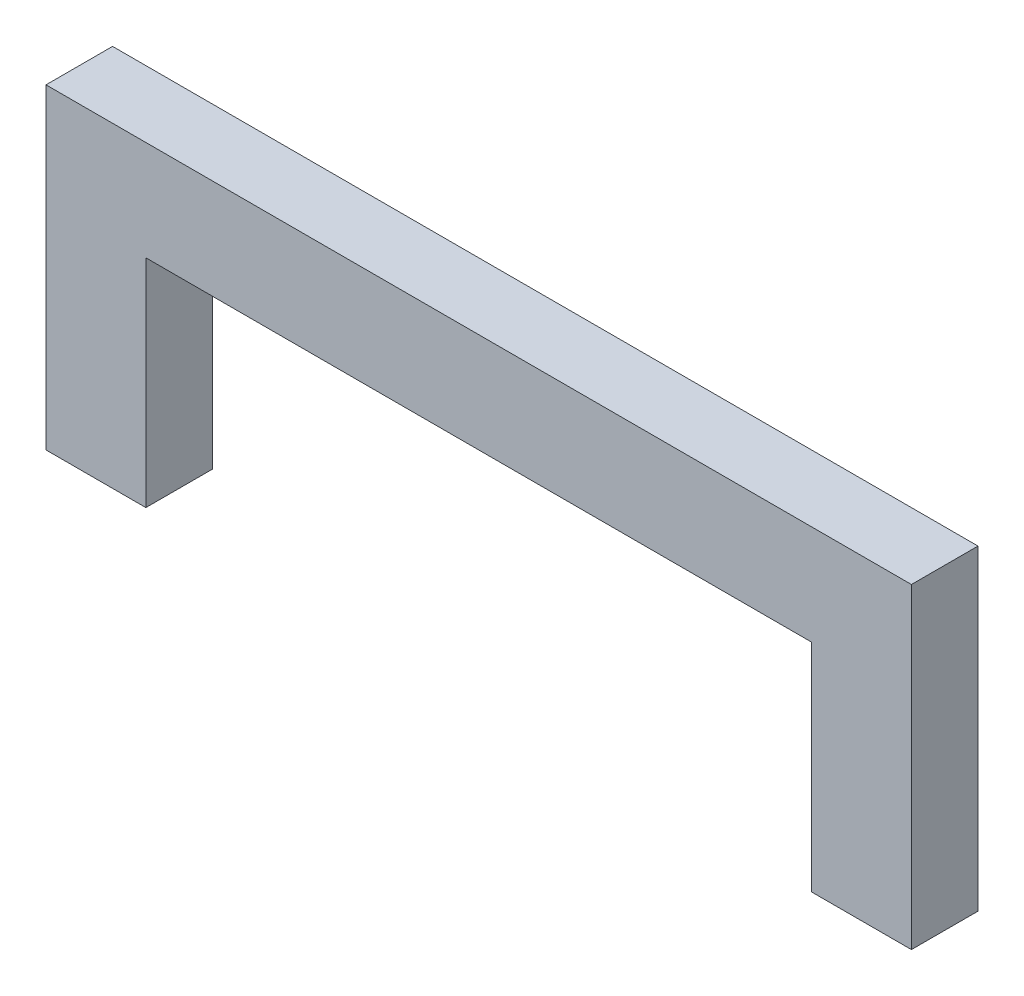
ISO-10303-21;
HEADER;
FILE_DESCRIPTION(('STEP AP214'),'2;1');
FILE_NAME('part.step','',(''),(''),'','','');
FILE_SCHEMA(('AUTOMOTIVE_DESIGN { 1 0 10303 214 1 1 1 1 }'));
ENDSEC;
DATA;
#1=APPLICATION_CONTEXT('core data for automotive mechanical design processes');
#2=APPLICATION_PROTOCOL_DEFINITION('international standard','automotive_design',2000,#1);
#3=PRODUCT_CONTEXT('',#1,'mechanical');
#4=PRODUCT('Part','Part','',(#3));
#5=PRODUCT_RELATED_PRODUCT_CATEGORY('part','',(#4));
#6=PRODUCT_DEFINITION_FORMATION('','',#4);
#7=PRODUCT_DEFINITION_CONTEXT('part definition',#1,'design');
#8=PRODUCT_DEFINITION('design','',#6,#7);
#9=PRODUCT_DEFINITION_SHAPE('','',#8);
#10=(LENGTH_UNIT() NAMED_UNIT(*) SI_UNIT(.MILLI.,.METRE.));
#11=(NAMED_UNIT(*) PLANE_ANGLE_UNIT() SI_UNIT($,.RADIAN.));
#12=(NAMED_UNIT(*) SI_UNIT($,.STERADIAN.) SOLID_ANGLE_UNIT());
#13=UNCERTAINTY_MEASURE_WITH_UNIT(LENGTH_MEASURE(1.E-05),#10,'distance_accuracy_value','');
#14=(GEOMETRIC_REPRESENTATION_CONTEXT(3) GLOBAL_UNCERTAINTY_ASSIGNED_CONTEXT((#13)) GLOBAL_UNIT_ASSIGNED_CONTEXT((#10,
#11,#12)) REPRESENTATION_CONTEXT('',''));
#15=CARTESIAN_POINT('',(0.,0.,0.));
#16=DIRECTION('',(0.,0.,1.));
#17=DIRECTION('',(1.,0.,0.));
#18=AXIS2_PLACEMENT_3D('',#15,#16,#17);
#19=CARTESIAN_POINT('',(-63.5,41.275,6.35));
#20=DIRECTION('',(-1.,0.,0.));
#21=DIRECTION('',(0.,-1.,0.));
#22=AXIS2_PLACEMENT_3D('',#19,#20,#21);
#23=PLANE('',#22);
#24=DIRECTION('',(0.,1.,0.));
#25=VECTOR('',#24,1.);
#26=CARTESIAN_POINT('',(-63.5,41.275,-6.35));
#27=LINE('',#26,#25);
#28=CARTESIAN_POINT('',(-63.5,0.,-6.35));
#29=VERTEX_POINT('',#28);
#30=CARTESIAN_POINT('',(-63.5,41.275,-6.35));
#31=VERTEX_POINT('',#30);
#32=EDGE_CURVE('E129',#29,#31,#27,.T.);
#33=ORIENTED_EDGE('',*,*,#32,.T.);
#34=DIRECTION('',(0.,0.,-1.));
#35=VECTOR('',#34,1.);
#36=CARTESIAN_POINT('',(-63.5,41.275,6.35));
#37=LINE('',#36,#35);
#38=CARTESIAN_POINT('',(-63.5,41.275,6.35));
#39=VERTEX_POINT('',#38);
#40=EDGE_CURVE('E11',#39,#31,#37,.T.);
#41=ORIENTED_EDGE('',*,*,#40,.F.);
#42=DIRECTION('',(0.,1.,0.));
#43=VECTOR('',#42,1.);
#44=CARTESIAN_POINT('',(-63.5,41.275,6.35));
#45=LINE('',#44,#43);
#46=CARTESIAN_POINT('',(-63.5,0.,6.35));
#47=VERTEX_POINT('',#46);
#48=EDGE_CURVE('E143',#47,#39,#45,.T.);
#49=ORIENTED_EDGE('',*,*,#48,.F.);
#50=DIRECTION('',(0.,0.,-1.));
#51=VECTOR('',#50,1.);
#52=CARTESIAN_POINT('',(-63.5,0.,6.35));
#53=LINE('',#52,#51);
#54=EDGE_CURVE('E125',#47,#29,#53,.T.);
#55=ORIENTED_EDGE('',*,*,#54,.T.);
#56=EDGE_LOOP('',(#33,#41,#49,#55));
#57=FACE_BOUND('',#56,.T.);
#58=ADVANCED_FACE('F33',(#57),#23,.F.);
#59=CARTESIAN_POINT('',(63.5,41.275,6.35));
#60=DIRECTION('',(0.,1.,0.));
#61=DIRECTION('',(0.,0.,1.));
#62=AXIS2_PLACEMENT_3D('',#59,#60,#61);
#63=PLANE('',#62);
#64=DIRECTION('',(1.,0.,0.));
#65=VECTOR('',#64,1.);
#66=CARTESIAN_POINT('',(63.5,41.275,-6.35));
#67=LINE('',#66,#65);
#68=CARTESIAN_POINT('',(63.5,41.275,-6.35));
#69=VERTEX_POINT('',#68);
#70=EDGE_CURVE('E132',#31,#69,#67,.T.);
#71=ORIENTED_EDGE('',*,*,#70,.T.);
#72=DIRECTION('',(0.,0.,-1.));
#73=VECTOR('',#72,1.);
#74=CARTESIAN_POINT('',(63.5,41.275,6.35));
#75=LINE('',#74,#73);
#76=CARTESIAN_POINT('',(63.5,41.275,6.35));
#77=VERTEX_POINT('',#76);
#78=EDGE_CURVE('E41',#77,#69,#75,.T.);
#79=ORIENTED_EDGE('',*,*,#78,.F.);
#80=DIRECTION('',(1.,0.,0.));
#81=VECTOR('',#80,1.);
#82=CARTESIAN_POINT('',(63.5,41.275,6.35));
#83=LINE('',#82,#81);
#84=EDGE_CURVE('E92',#39,#77,#83,.T.);
#85=ORIENTED_EDGE('',*,*,#84,.F.);
#86=ORIENTED_EDGE('',*,*,#40,.T.);
#87=EDGE_LOOP('',(#71,#79,#85,#86));
#88=FACE_BOUND('',#87,.T.);
#89=ADVANCED_FACE('F178',(#88),#63,.F.);
#90=CARTESIAN_POINT('',(63.5,41.275,6.35));
#91=DIRECTION('',(1.,0.,0.));
#92=DIRECTION('',(0.,1.,0.));
#93=AXIS2_PLACEMENT_3D('',#90,#91,#92);
#94=PLANE('',#93);
#95=DIRECTION('',(0.,-1.,0.));
#96=VECTOR('',#95,1.);
#97=CARTESIAN_POINT('',(63.5,41.275,-6.35));
#98=LINE('',#97,#96);
#99=CARTESIAN_POINT('',(63.5,0.,-6.35));
#100=VERTEX_POINT('',#99);
#101=EDGE_CURVE('E134',#69,#100,#98,.T.);
#102=ORIENTED_EDGE('',*,*,#101,.T.);
#103=DIRECTION('',(0.,0.,-1.));
#104=VECTOR('',#103,1.);
#105=CARTESIAN_POINT('',(63.5,0.,6.35));
#106=LINE('',#105,#104);
#107=CARTESIAN_POINT('',(63.5,0.,6.35));
#108=VERTEX_POINT('',#107);
#109=EDGE_CURVE('E150',#108,#100,#106,.T.);
#110=ORIENTED_EDGE('',*,*,#109,.F.);
#111=DIRECTION('',(0.,-1.,0.));
#112=VECTOR('',#111,1.);
#113=CARTESIAN_POINT('',(63.5,41.275,6.35));
#114=LINE('',#113,#112);
#115=EDGE_CURVE('E158',#77,#108,#114,.T.);
#116=ORIENTED_EDGE('',*,*,#115,.F.);
#117=ORIENTED_EDGE('',*,*,#78,.T.);
#118=EDGE_LOOP('',(#102,#110,#116,#117));
#119=FACE_BOUND('',#118,.T.);
#120=ADVANCED_FACE('F156',(#119),#94,.F.);
#121=CARTESIAN_POINT('',(63.5,0.,6.35));
#122=DIRECTION('',(0.,1.,0.));
#123=DIRECTION('',(-1.,0.,0.));
#124=AXIS2_PLACEMENT_3D('',#121,#122,#123);
#125=PLANE('',#124);
#126=DIRECTION('',(1.,0.,0.));
#127=VECTOR('',#126,1.);
#128=CARTESIAN_POINT('',(63.5,0.,-6.35));
#129=LINE('',#128,#127);
#130=CARTESIAN_POINT('',(82.55,0.,-6.35));
#131=VERTEX_POINT('',#130);
#132=EDGE_CURVE('E136',#100,#131,#129,.T.);
#133=ORIENTED_EDGE('',*,*,#132,.T.);
#134=DIRECTION('',(0.,0.,-1.));
#135=VECTOR('',#134,1.);
#136=CARTESIAN_POINT('',(82.55,0.,6.35));
#137=LINE('',#136,#135);
#138=CARTESIAN_POINT('',(82.55,0.,6.35));
#139=VERTEX_POINT('',#138);
#140=EDGE_CURVE('E147',#139,#131,#137,.T.);
#141=ORIENTED_EDGE('',*,*,#140,.F.);
#142=DIRECTION('',(1.,0.,0.));
#143=VECTOR('',#142,1.);
#144=CARTESIAN_POINT('',(63.5,0.,6.35));
#145=LINE('',#144,#143);
#146=EDGE_CURVE('E170',#108,#139,#145,.T.);
#147=ORIENTED_EDGE('',*,*,#146,.F.);
#148=ORIENTED_EDGE('',*,*,#109,.T.);
#149=EDGE_LOOP('',(#133,#141,#147,#148));
#150=FACE_BOUND('',#149,.T.);
#151=ADVANCED_FACE('F166',(#150),#125,.F.);
#152=CARTESIAN_POINT('',(82.55,0.,6.35));
#153=DIRECTION('',(-1.,0.,0.));
#154=DIRECTION('',(0.,0.,1.));
#155=AXIS2_PLACEMENT_3D('',#152,#153,#154);
#156=PLANE('',#155);
#157=DIRECTION('',(0.,1.,0.));
#158=VECTOR('',#157,1.);
#159=CARTESIAN_POINT('',(82.55,0.,-6.35));
#160=LINE('',#159,#158);
#161=CARTESIAN_POINT('',(82.55,60.325,-6.35));
#162=VERTEX_POINT('',#161);
#163=EDGE_CURVE('E138',#131,#162,#160,.T.);
#164=ORIENTED_EDGE('',*,*,#163,.T.);
#165=DIRECTION('',(0.,0.,-1.));
#166=VECTOR('',#165,1.);
#167=CARTESIAN_POINT('',(82.55,60.325,6.35));
#168=LINE('',#167,#166);
#169=CARTESIAN_POINT('',(82.55,60.325,6.35));
#170=VERTEX_POINT('',#169);
#171=EDGE_CURVE('E120',#170,#162,#168,.T.);
#172=ORIENTED_EDGE('',*,*,#171,.F.);
#173=DIRECTION('',(0.,1.,0.));
#174=VECTOR('',#173,1.);
#175=CARTESIAN_POINT('',(82.55,0.,6.35));
#176=LINE('',#175,#174);
#177=EDGE_CURVE('E111',#139,#170,#176,.T.);
#178=ORIENTED_EDGE('',*,*,#177,.F.);
#179=ORIENTED_EDGE('',*,*,#140,.T.);
#180=EDGE_LOOP('',(#164,#172,#178,#179));
#181=FACE_BOUND('',#180,.T.);
#182=ADVANCED_FACE('F169',(#181),#156,.F.);
#183=CARTESIAN_POINT('',(-82.55,60.325,6.35));
#184=DIRECTION('',(0.,-1.,0.));
#185=DIRECTION('',(0.,0.,-1.));
#186=AXIS2_PLACEMENT_3D('',#183,#184,#185);
#187=PLANE('',#186);
#188=DIRECTION('',(-1.,0.,0.));
#189=VECTOR('',#188,1.);
#190=CARTESIAN_POINT('',(-82.55,60.325,-6.35));
#191=LINE('',#190,#189);
#192=CARTESIAN_POINT('',(-82.55,60.325,-6.35));
#193=VERTEX_POINT('',#192);
#194=EDGE_CURVE('E119',#162,#193,#191,.T.);
#195=ORIENTED_EDGE('',*,*,#194,.T.);
#196=DIRECTION('',(0.,0.,-1.));
#197=VECTOR('',#196,1.);
#198=CARTESIAN_POINT('',(-82.55,60.325,6.35));
#199=LINE('',#198,#197);
#200=CARTESIAN_POINT('',(-82.55,60.325,6.35));
#201=VERTEX_POINT('',#200);
#202=EDGE_CURVE('E116',#201,#193,#199,.T.);
#203=ORIENTED_EDGE('',*,*,#202,.F.);
#204=DIRECTION('',(-1.,0.,0.));
#205=VECTOR('',#204,1.);
#206=CARTESIAN_POINT('',(-82.55,60.325,6.35));
#207=LINE('',#206,#205);
#208=EDGE_CURVE('E105',#170,#201,#207,.T.);
#209=ORIENTED_EDGE('',*,*,#208,.F.);
#210=ORIENTED_EDGE('',*,*,#171,.T.);
#211=EDGE_LOOP('',(#195,#203,#209,#210));
#212=FACE_BOUND('',#211,.T.);
#213=ADVANCED_FACE('F117',(#212),#187,.F.);
#214=CARTESIAN_POINT('',(-82.55,0.,6.35));
#215=DIRECTION('',(1.,0.,0.));
#216=DIRECTION('',(0.,0.,-1.));
#217=AXIS2_PLACEMENT_3D('',#214,#215,#216);
#218=PLANE('',#217);
#219=DIRECTION('',(0.,-1.,0.));
#220=VECTOR('',#219,1.);
#221=CARTESIAN_POINT('',(-82.55,0.,-6.35));
#222=LINE('',#221,#220);
#223=CARTESIAN_POINT('',(-82.55,0.,-6.35));
#224=VERTEX_POINT('',#223);
#225=EDGE_CURVE('E78',#193,#224,#222,.T.);
#226=ORIENTED_EDGE('',*,*,#225,.T.);
#227=DIRECTION('',(0.,0.,-1.));
#228=VECTOR('',#227,1.);
#229=CARTESIAN_POINT('',(-82.55,0.,6.35));
#230=LINE('',#229,#228);
#231=CARTESIAN_POINT('',(-82.55,0.,6.35));
#232=VERTEX_POINT('',#231);
#233=EDGE_CURVE('E121',#232,#224,#230,.T.);
#234=ORIENTED_EDGE('',*,*,#233,.F.);
#235=DIRECTION('',(0.,-1.,0.));
#236=VECTOR('',#235,1.);
#237=CARTESIAN_POINT('',(-82.55,0.,6.35));
#238=LINE('',#237,#236);
#239=EDGE_CURVE('E109',#201,#232,#238,.T.);
#240=ORIENTED_EDGE('',*,*,#239,.F.);
#241=ORIENTED_EDGE('',*,*,#202,.T.);
#242=EDGE_LOOP('',(#226,#234,#240,#241));
#243=FACE_BOUND('',#242,.T.);
#244=ADVANCED_FACE('F123',(#243),#218,.F.);
#245=CARTESIAN_POINT('',(-63.5,0.,6.35));
#246=DIRECTION('',(0.,1.,0.));
#247=DIRECTION('',(-1.,0.,0.));
#248=AXIS2_PLACEMENT_3D('',#245,#246,#247);
#249=PLANE('',#248);
#250=DIRECTION('',(1.,0.,0.));
#251=VECTOR('',#250,1.);
#252=CARTESIAN_POINT('',(-63.5,0.,-6.35));
#253=LINE('',#252,#251);
#254=EDGE_CURVE('E84',#224,#29,#253,.T.);
#255=ORIENTED_EDGE('',*,*,#254,.T.);
#256=ORIENTED_EDGE('',*,*,#54,.F.);
#257=DIRECTION('',(1.,0.,0.));
#258=VECTOR('',#257,1.);
#259=CARTESIAN_POINT('',(-63.5,0.,6.35));
#260=LINE('',#259,#258);
#261=EDGE_CURVE('E49',#232,#47,#260,.T.);
#262=ORIENTED_EDGE('',*,*,#261,.F.);
#263=ORIENTED_EDGE('',*,*,#233,.T.);
#264=EDGE_LOOP('',(#255,#256,#262,#263));
#265=FACE_BOUND('',#264,.T.);
#266=ADVANCED_FACE('F194',(#265),#249,.F.);
#267=CARTESIAN_POINT('',(0.,0.,6.35));
#268=DIRECTION('',(0.,0.,-1.));
#269=DIRECTION('',(-1.,0.,0.));
#270=AXIS2_PLACEMENT_3D('',#267,#268,#269);
#271=PLANE('',#270);
#272=ORIENTED_EDGE('',*,*,#48,.T.);
#273=ORIENTED_EDGE('',*,*,#84,.T.);
#274=ORIENTED_EDGE('',*,*,#115,.T.);
#275=ORIENTED_EDGE('',*,*,#146,.T.);
#276=ORIENTED_EDGE('',*,*,#177,.T.);
#277=ORIENTED_EDGE('',*,*,#208,.T.);
#278=ORIENTED_EDGE('',*,*,#239,.T.);
#279=ORIENTED_EDGE('',*,*,#261,.T.);
#280=EDGE_LOOP('',(#272,#273,#274,#275,#276,#277,#278,#279));
#281=FACE_BOUND('',#280,.T.);
#282=ADVANCED_FACE('F107',(#281),#271,.F.);
#283=CARTESIAN_POINT('',(0.,0.,-6.35));
#284=DIRECTION('',(0.,0.,-1.));
#285=DIRECTION('',(-1.,0.,0.));
#286=AXIS2_PLACEMENT_3D('',#283,#284,#285);
#287=PLANE('',#286);
#288=ORIENTED_EDGE('',*,*,#32,.F.);
#289=ORIENTED_EDGE('',*,*,#254,.F.);
#290=ORIENTED_EDGE('',*,*,#225,.F.);
#291=ORIENTED_EDGE('',*,*,#194,.F.);
#292=ORIENTED_EDGE('',*,*,#163,.F.);
#293=ORIENTED_EDGE('',*,*,#132,.F.);
#294=ORIENTED_EDGE('',*,*,#101,.F.);
#295=ORIENTED_EDGE('',*,*,#70,.F.);
#296=EDGE_LOOP('',(#288,#289,#290,#291,#292,#293,#294,#295));
#297=FACE_BOUND('',#296,.T.);
#298=ADVANCED_FACE('F162',(#297),#287,.T.);
#299=CLOSED_SHELL('',(#58,#89,#120,#151,#182,#213,#244,#266,#282,#298));
#300=MANIFOLD_SOLID_BREP('B2',#299);
#301=ADVANCED_BREP_SHAPE_REPRESENTATION('',(#18,#300),#14);
#302=SHAPE_DEFINITION_REPRESENTATION(#9,#301);
ENDSEC;
END-ISO-10303-21;
